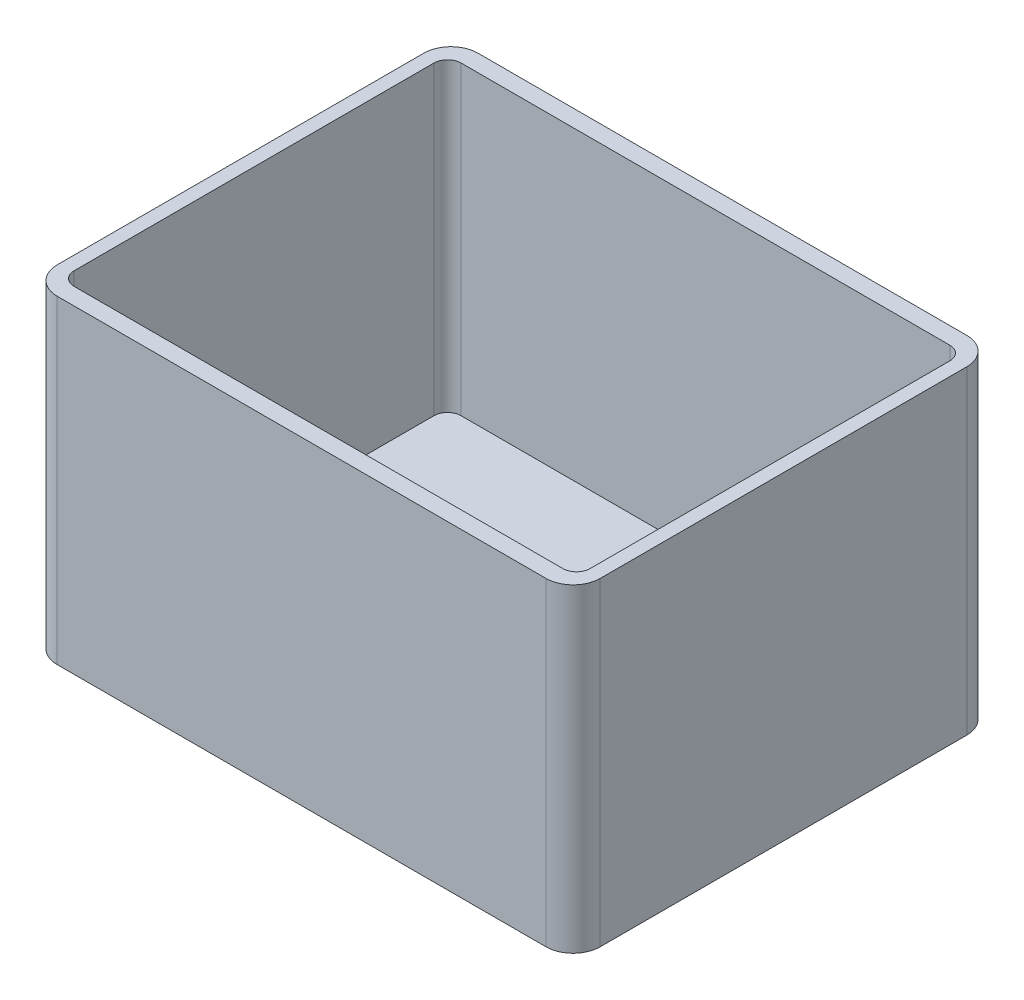
ISO-10303-21;
HEADER;
FILE_DESCRIPTION(('STEP AP214'),'2;1');
FILE_NAME('part.step','',(''),(''),'','','');
FILE_SCHEMA(('AUTOMOTIVE_DESIGN { 1 0 10303 214 1 1 1 1 }'));
ENDSEC;
DATA;
#1=APPLICATION_CONTEXT('core data for automotive mechanical design processes');
#2=APPLICATION_PROTOCOL_DEFINITION('international standard','automotive_design',2000,#1);
#3=PRODUCT_CONTEXT('',#1,'mechanical');
#4=PRODUCT('Part','Part','',(#3));
#5=PRODUCT_RELATED_PRODUCT_CATEGORY('part','',(#4));
#6=PRODUCT_DEFINITION_FORMATION('','',#4);
#7=PRODUCT_DEFINITION_CONTEXT('part definition',#1,'design');
#8=PRODUCT_DEFINITION('design','',#6,#7);
#9=PRODUCT_DEFINITION_SHAPE('','',#8);
#10=(LENGTH_UNIT() NAMED_UNIT(*) SI_UNIT(.MILLI.,.METRE.));
#11=(NAMED_UNIT(*) PLANE_ANGLE_UNIT() SI_UNIT($,.RADIAN.));
#12=(NAMED_UNIT(*) SI_UNIT($,.STERADIAN.) SOLID_ANGLE_UNIT());
#13=UNCERTAINTY_MEASURE_WITH_UNIT(LENGTH_MEASURE(1.E-05),#10,'distance_accuracy_value','');
#14=(GEOMETRIC_REPRESENTATION_CONTEXT(3) GLOBAL_UNCERTAINTY_ASSIGNED_CONTEXT((#13)) GLOBAL_UNIT_ASSIGNED_CONTEXT((#10,
#11,#12)) REPRESENTATION_CONTEXT('',''));
#15=CARTESIAN_POINT('',(0.,0.,0.));
#16=DIRECTION('',(0.,0.,1.));
#17=DIRECTION('',(1.,0.,0.));
#18=AXIS2_PLACEMENT_3D('',#15,#16,#17);
#19=CARTESIAN_POINT('',(-180.,235.,135.));
#20=DIRECTION('',(0.,-1.,0.));
#21=DIRECTION('',(0.,0.,-1.));
#22=AXIS2_PLACEMENT_3D('',#19,#20,#21);
#23=CYLINDRICAL_SURFACE('',#22,20.);
#24=CARTESIAN_POINT('',(-180.,0.,135.));
#25=DIRECTION('',(0.,1.,0.));
#26=DIRECTION('',(0.,0.,-1.));
#27=AXIS2_PLACEMENT_3D('',#24,#25,#26);
#28=CIRCLE('',#27,20.);
#29=CARTESIAN_POINT('',(-200.,0.,135.));
#30=VERTEX_POINT('',#29);
#31=CARTESIAN_POINT('',(-180.,0.,155.));
#32=VERTEX_POINT('',#31);
#33=EDGE_CURVE('E149',#30,#32,#28,.T.);
#34=ORIENTED_EDGE('',*,*,#33,.T.);
#35=DIRECTION('',(0.,-1.,0.));
#36=VECTOR('',#35,1.);
#37=CARTESIAN_POINT('',(-180.,235.,155.));
#38=LINE('',#37,#36);
#39=CARTESIAN_POINT('',(-180.,235.,155.));
#40=VERTEX_POINT('',#39);
#41=EDGE_CURVE('E11',#40,#32,#38,.T.);
#42=ORIENTED_EDGE('',*,*,#41,.F.);
#43=CARTESIAN_POINT('',(-180.,235.,135.));
#44=DIRECTION('',(0.,1.,0.));
#45=DIRECTION('',(0.,0.,-1.));
#46=AXIS2_PLACEMENT_3D('',#43,#44,#45);
#47=CIRCLE('',#46,20.);
#48=CARTESIAN_POINT('',(-200.,235.,135.));
#49=VERTEX_POINT('',#48);
#50=EDGE_CURVE('E165',#49,#40,#47,.T.);
#51=ORIENTED_EDGE('',*,*,#50,.F.);
#52=DIRECTION('',(0.,-1.,0.));
#53=VECTOR('',#52,1.);
#54=CARTESIAN_POINT('',(-200.,235.,135.));
#55=LINE('',#54,#53);
#56=EDGE_CURVE('E145',#49,#30,#55,.T.);
#57=ORIENTED_EDGE('',*,*,#56,.T.);
#58=EDGE_LOOP('',(#34,#42,#51,#57));
#59=FACE_BOUND('',#58,.T.);
#60=ADVANCED_FACE('F41',(#59),#23,.T.);
#61=CARTESIAN_POINT('',(-180.,235.,155.));
#62=DIRECTION('',(0.,0.,-1.));
#63=DIRECTION('',(-1.,0.,0.));
#64=AXIS2_PLACEMENT_3D('',#61,#62,#63);
#65=PLANE('',#64);
#66=DIRECTION('',(1.,0.,0.));
#67=VECTOR('',#66,1.);
#68=CARTESIAN_POINT('',(-180.,0.,155.));
#69=LINE('',#68,#67);
#70=CARTESIAN_POINT('',(180.,0.,155.));
#71=VERTEX_POINT('',#70);
#72=EDGE_CURVE('E152',#32,#71,#69,.T.);
#73=ORIENTED_EDGE('',*,*,#72,.T.);
#74=DIRECTION('',(0.,-1.,0.));
#75=VECTOR('',#74,1.);
#76=CARTESIAN_POINT('',(180.,235.,155.));
#77=LINE('',#76,#75);
#78=CARTESIAN_POINT('',(180.,235.,155.));
#79=VERTEX_POINT('',#78);
#80=EDGE_CURVE('E48',#79,#71,#77,.T.);
#81=ORIENTED_EDGE('',*,*,#80,.F.);
#82=DIRECTION('',(1.,0.,0.));
#83=VECTOR('',#82,1.);
#84=CARTESIAN_POINT('',(-180.,235.,155.));
#85=LINE('',#84,#83);
#86=EDGE_CURVE('E105',#40,#79,#85,.T.);
#87=ORIENTED_EDGE('',*,*,#86,.F.);
#88=ORIENTED_EDGE('',*,*,#41,.T.);
#89=EDGE_LOOP('',(#73,#81,#87,#88));
#90=FACE_BOUND('',#89,.T.);
#91=ADVANCED_FACE('F339',(#90),#65,.F.);
#92=CARTESIAN_POINT('',(180.,235.,135.));
#93=DIRECTION('',(0.,-1.,0.));
#94=DIRECTION('',(0.,0.,-1.));
#95=AXIS2_PLACEMENT_3D('',#92,#93,#94);
#96=CYLINDRICAL_SURFACE('',#95,20.);
#97=CARTESIAN_POINT('',(180.,0.,135.));
#98=DIRECTION('',(0.,1.,0.));
#99=DIRECTION('',(0.,0.,1.));
#100=AXIS2_PLACEMENT_3D('',#97,#98,#99);
#101=CIRCLE('',#100,20.);
#102=CARTESIAN_POINT('',(200.,0.,135.));
#103=VERTEX_POINT('',#102);
#104=EDGE_CURVE('E155',#71,#103,#101,.T.);
#105=ORIENTED_EDGE('',*,*,#104,.T.);
#106=DIRECTION('',(0.,-1.,0.));
#107=VECTOR('',#106,1.);
#108=CARTESIAN_POINT('',(200.,235.,135.));
#109=LINE('',#108,#107);
#110=CARTESIAN_POINT('',(200.,235.,135.));
#111=VERTEX_POINT('',#110);
#112=EDGE_CURVE('E172',#111,#103,#109,.T.);
#113=ORIENTED_EDGE('',*,*,#112,.F.);
#114=CARTESIAN_POINT('',(180.,235.,135.));
#115=DIRECTION('',(0.,1.,0.));
#116=DIRECTION('',(0.,0.,1.));
#117=AXIS2_PLACEMENT_3D('',#114,#115,#116);
#118=CIRCLE('',#117,20.);
#119=EDGE_CURVE('E180',#79,#111,#118,.T.);
#120=ORIENTED_EDGE('',*,*,#119,.F.);
#121=ORIENTED_EDGE('',*,*,#80,.T.);
#122=EDGE_LOOP('',(#105,#113,#120,#121));
#123=FACE_BOUND('',#122,.T.);
#124=ADVANCED_FACE('F178',(#123),#96,.T.);
#125=CARTESIAN_POINT('',(200.,235.,135.));
#126=DIRECTION('',(-1.,0.,0.));
#127=DIRECTION('',(0.,0.,1.));
#128=AXIS2_PLACEMENT_3D('',#125,#126,#127);
#129=PLANE('',#128);
#130=DIRECTION('',(0.,0.,-1.));
#131=VECTOR('',#130,1.);
#132=CARTESIAN_POINT('',(200.,0.,135.));
#133=LINE('',#132,#131);
#134=CARTESIAN_POINT('',(200.,0.,-135.));
#135=VERTEX_POINT('',#134);
#136=EDGE_CURVE('E157',#103,#135,#133,.T.);
#137=ORIENTED_EDGE('',*,*,#136,.T.);
#138=DIRECTION('',(0.,-1.,0.));
#139=VECTOR('',#138,1.);
#140=CARTESIAN_POINT('',(200.,235.,-135.));
#141=LINE('',#140,#139);
#142=CARTESIAN_POINT('',(200.,235.,-135.));
#143=VERTEX_POINT('',#142);
#144=EDGE_CURVE('E169',#143,#135,#141,.T.);
#145=ORIENTED_EDGE('',*,*,#144,.F.);
#146=DIRECTION('',(0.,0.,-1.));
#147=VECTOR('',#146,1.);
#148=CARTESIAN_POINT('',(200.,235.,135.));
#149=LINE('',#148,#147);
#150=EDGE_CURVE('E192',#111,#143,#149,.T.);
#151=ORIENTED_EDGE('',*,*,#150,.F.);
#152=ORIENTED_EDGE('',*,*,#112,.T.);
#153=EDGE_LOOP('',(#137,#145,#151,#152));
#154=FACE_BOUND('',#153,.T.);
#155=ADVANCED_FACE('F188',(#154),#129,.F.);
#156=CARTESIAN_POINT('',(180.,235.,-135.));
#157=DIRECTION('',(0.,-1.,0.));
#158=DIRECTION('',(0.,0.,-1.));
#159=AXIS2_PLACEMENT_3D('',#156,#157,#158);
#160=CYLINDRICAL_SURFACE('',#159,20.);
#161=CARTESIAN_POINT('',(180.,0.,-135.));
#162=DIRECTION('',(0.,1.,0.));
#163=DIRECTION('',(0.,0.,-1.));
#164=AXIS2_PLACEMENT_3D('',#161,#162,#163);
#165=CIRCLE('',#164,20.);
#166=CARTESIAN_POINT('',(180.,0.,-155.));
#167=VERTEX_POINT('',#166);
#168=EDGE_CURVE('E159',#135,#167,#165,.T.);
#169=ORIENTED_EDGE('',*,*,#168,.T.);
#170=DIRECTION('',(0.,-1.,0.));
#171=VECTOR('',#170,1.);
#172=CARTESIAN_POINT('',(180.,235.,-155.));
#173=LINE('',#172,#171);
#174=CARTESIAN_POINT('',(180.,235.,-155.));
#175=VERTEX_POINT('',#174);
#176=EDGE_CURVE('E140',#175,#167,#173,.T.);
#177=ORIENTED_EDGE('',*,*,#176,.F.);
#178=CARTESIAN_POINT('',(180.,235.,-135.));
#179=DIRECTION('',(0.,1.,0.));
#180=DIRECTION('',(0.,0.,-1.));
#181=AXIS2_PLACEMENT_3D('',#178,#179,#180);
#182=CIRCLE('',#181,20.);
#183=EDGE_CURVE('E128',#143,#175,#182,.T.);
#184=ORIENTED_EDGE('',*,*,#183,.F.);
#185=ORIENTED_EDGE('',*,*,#144,.T.);
#186=EDGE_LOOP('',(#169,#177,#184,#185));
#187=FACE_BOUND('',#186,.T.);
#188=ADVANCED_FACE('F191',(#187),#160,.T.);
#189=CARTESIAN_POINT('',(-180.,235.,-155.));
#190=DIRECTION('',(0.,0.,1.));
#191=DIRECTION('',(1.,0.,0.));
#192=AXIS2_PLACEMENT_3D('',#189,#190,#191);
#193=PLANE('',#192);
#194=DIRECTION('',(-1.,0.,0.));
#195=VECTOR('',#194,1.);
#196=CARTESIAN_POINT('',(-180.,0.,-155.));
#197=LINE('',#196,#195);
#198=CARTESIAN_POINT('',(-180.,0.,-155.));
#199=VERTEX_POINT('',#198);
#200=EDGE_CURVE('E137',#167,#199,#197,.T.);
#201=ORIENTED_EDGE('',*,*,#200,.T.);
#202=DIRECTION('',(0.,-1.,0.));
#203=VECTOR('',#202,1.);
#204=CARTESIAN_POINT('',(-180.,235.,-155.));
#205=LINE('',#204,#203);
#206=CARTESIAN_POINT('',(-180.,235.,-155.));
#207=VERTEX_POINT('',#206);
#208=EDGE_CURVE('E134',#207,#199,#205,.T.);
#209=ORIENTED_EDGE('',*,*,#208,.F.);
#210=DIRECTION('',(-1.,0.,0.));
#211=VECTOR('',#210,1.);
#212=CARTESIAN_POINT('',(-180.,235.,-155.));
#213=LINE('',#212,#211);
#214=EDGE_CURVE('E121',#175,#207,#213,.T.);
#215=ORIENTED_EDGE('',*,*,#214,.F.);
#216=ORIENTED_EDGE('',*,*,#176,.T.);
#217=EDGE_LOOP('',(#201,#209,#215,#216));
#218=FACE_BOUND('',#217,.T.);
#219=ADVANCED_FACE('F135',(#218),#193,.F.);
#220=CARTESIAN_POINT('',(-180.,235.,-135.));
#221=DIRECTION('',(0.,-1.,0.));
#222=DIRECTION('',(0.,0.,-1.));
#223=AXIS2_PLACEMENT_3D('',#220,#221,#222);
#224=CYLINDRICAL_SURFACE('',#223,20.);
#225=CARTESIAN_POINT('',(-180.,0.,-135.));
#226=DIRECTION('',(0.,1.,0.));
#227=DIRECTION('',(0.,0.,-1.));
#228=AXIS2_PLACEMENT_3D('',#225,#226,#227);
#229=CIRCLE('',#228,20.);
#230=CARTESIAN_POINT('',(-200.,0.,-135.));
#231=VERTEX_POINT('',#230);
#232=EDGE_CURVE('E162',#199,#231,#229,.T.);
#233=ORIENTED_EDGE('',*,*,#232,.T.);
#234=DIRECTION('',(0.,-1.,0.));
#235=VECTOR('',#234,1.);
#236=CARTESIAN_POINT('',(-200.,235.,-135.));
#237=LINE('',#236,#235);
#238=CARTESIAN_POINT('',(-200.,235.,-135.));
#239=VERTEX_POINT('',#238);
#240=EDGE_CURVE('E141',#239,#231,#237,.T.);
#241=ORIENTED_EDGE('',*,*,#240,.F.);
#242=CARTESIAN_POINT('',(-180.,235.,-135.));
#243=DIRECTION('',(0.,1.,0.));
#244=DIRECTION('',(0.,0.,-1.));
#245=AXIS2_PLACEMENT_3D('',#242,#243,#244);
#246=CIRCLE('',#245,20.);
#247=EDGE_CURVE('E125',#207,#239,#246,.T.);
#248=ORIENTED_EDGE('',*,*,#247,.F.);
#249=ORIENTED_EDGE('',*,*,#208,.T.);
#250=EDGE_LOOP('',(#233,#241,#248,#249));
#251=FACE_BOUND('',#250,.T.);
#252=ADVANCED_FACE('F143',(#251),#224,.T.);
#253=CARTESIAN_POINT('',(-200.,235.,135.));
#254=DIRECTION('',(1.,0.,0.));
#255=DIRECTION('',(0.,0.,-1.));
#256=AXIS2_PLACEMENT_3D('',#253,#254,#255);
#257=PLANE('',#256);
#258=DIRECTION('',(0.,0.,1.));
#259=VECTOR('',#258,1.);
#260=CARTESIAN_POINT('',(-200.,0.,135.));
#261=LINE('',#260,#259);
#262=EDGE_CURVE('E97',#231,#30,#261,.T.);
#263=ORIENTED_EDGE('',*,*,#262,.T.);
#264=ORIENTED_EDGE('',*,*,#56,.F.);
#265=DIRECTION('',(0.,0.,1.));
#266=VECTOR('',#265,1.);
#267=CARTESIAN_POINT('',(-200.,235.,135.));
#268=LINE('',#267,#266);
#269=EDGE_CURVE('E64',#239,#49,#268,.T.);
#270=ORIENTED_EDGE('',*,*,#269,.F.);
#271=ORIENTED_EDGE('',*,*,#240,.T.);
#272=EDGE_LOOP('',(#263,#264,#270,#271));
#273=FACE_BOUND('',#272,.T.);
#274=ADVANCED_FACE('F346',(#273),#257,.F.);
#275=CARTESIAN_POINT('',(-180.,235.,135.));
#276=DIRECTION('',(0.,-1.,0.));
#277=DIRECTION('',(0.,0.,-1.));
#278=AXIS2_PLACEMENT_3D('',#275,#276,#277);
#279=PLANE('',#278);
#280=DIRECTION('',(1.,0.,0.));
#281=VECTOR('',#280,1.);
#282=CARTESIAN_POINT('',(-180.,235.,142.5));
#283=LINE('',#282,#281);
#284=CARTESIAN_POINT('',(-180.,235.,142.5));
#285=VERTEX_POINT('',#284);
#286=CARTESIAN_POINT('',(180.,235.,142.5));
#287=VERTEX_POINT('',#286);
#288=EDGE_CURVE('E239',#285,#287,#283,.T.);
#289=ORIENTED_EDGE('',*,*,#288,.F.);
#290=CARTESIAN_POINT('',(-180.,235.,132.5));
#291=DIRECTION('',(0.,1.,0.));
#292=DIRECTION('',(0.,0.,-1.));
#293=AXIS2_PLACEMENT_3D('',#290,#291,#292);
#294=CIRCLE('',#293,10.);
#295=CARTESIAN_POINT('',(-190.,235.,132.5));
#296=VERTEX_POINT('',#295);
#297=EDGE_CURVE('E55',#296,#285,#294,.T.);
#298=ORIENTED_EDGE('',*,*,#297,.F.);
#299=DIRECTION('',(0.,0.,1.));
#300=VECTOR('',#299,1.);
#301=CARTESIAN_POINT('',(-190.,235.,132.5));
#302=LINE('',#301,#300);
#303=CARTESIAN_POINT('',(-190.,235.,-132.5));
#304=VERTEX_POINT('',#303);
#305=EDGE_CURVE('E220',#304,#296,#302,.T.);
#306=ORIENTED_EDGE('',*,*,#305,.F.);
#307=CARTESIAN_POINT('',(-180.,235.,-132.5));
#308=DIRECTION('',(0.,1.,0.));
#309=DIRECTION('',(0.,0.,-1.));
#310=AXIS2_PLACEMENT_3D('',#307,#308,#309);
#311=CIRCLE('',#310,10.);
#312=CARTESIAN_POINT('',(-180.,235.,-142.5));
#313=VERTEX_POINT('',#312);
#314=EDGE_CURVE('E224',#313,#304,#311,.T.);
#315=ORIENTED_EDGE('',*,*,#314,.F.);
#316=DIRECTION('',(-1.,0.,0.));
#317=VECTOR('',#316,1.);
#318=CARTESIAN_POINT('',(-180.,235.,-142.5));
#319=LINE('',#318,#317);
#320=CARTESIAN_POINT('',(180.,235.,-142.5));
#321=VERTEX_POINT('',#320);
#322=EDGE_CURVE('E227',#321,#313,#319,.T.);
#323=ORIENTED_EDGE('',*,*,#322,.F.);
#324=CARTESIAN_POINT('',(180.,235.,-132.5));
#325=DIRECTION('',(0.,1.,0.));
#326=DIRECTION('',(0.,0.,-1.));
#327=AXIS2_PLACEMENT_3D('',#324,#325,#326);
#328=CIRCLE('',#327,10.);
#329=CARTESIAN_POINT('',(190.,235.,-132.5));
#330=VERTEX_POINT('',#329);
#331=EDGE_CURVE('E230',#330,#321,#328,.T.);
#332=ORIENTED_EDGE('',*,*,#331,.F.);
#333=DIRECTION('',(0.,0.,-1.));
#334=VECTOR('',#333,1.);
#335=CARTESIAN_POINT('',(190.,235.,132.5));
#336=LINE('',#335,#334);
#337=CARTESIAN_POINT('',(190.,235.,132.5));
#338=VERTEX_POINT('',#337);
#339=EDGE_CURVE('E233',#338,#330,#336,.T.);
#340=ORIENTED_EDGE('',*,*,#339,.F.);
#341=CARTESIAN_POINT('',(180.,235.,132.5));
#342=DIRECTION('',(0.,1.,0.));
#343=DIRECTION('',(0.,0.,1.));
#344=AXIS2_PLACEMENT_3D('',#341,#342,#343);
#345=CIRCLE('',#344,10.);
#346=EDGE_CURVE('E236',#287,#338,#345,.T.);
#347=ORIENTED_EDGE('',*,*,#346,.F.);
#348=EDGE_LOOP('',(#289,#298,#306,#315,#323,#332,#340,#347));
#349=FACE_BOUND('',#348,.T.);
#350=ORIENTED_EDGE('',*,*,#50,.T.);
#351=ORIENTED_EDGE('',*,*,#86,.T.);
#352=ORIENTED_EDGE('',*,*,#119,.T.);
#353=ORIENTED_EDGE('',*,*,#150,.T.);
#354=ORIENTED_EDGE('',*,*,#183,.T.);
#355=ORIENTED_EDGE('',*,*,#214,.T.);
#356=ORIENTED_EDGE('',*,*,#247,.T.);
#357=ORIENTED_EDGE('',*,*,#269,.T.);
#358=EDGE_LOOP('',(#350,#351,#352,#353,#354,#355,#356,#357));
#359=FACE_BOUND('',#358,.T.);
#360=ADVANCED_FACE('F123',(#349,#359),#279,.F.);
#361=CARTESIAN_POINT('',(-180.,0.,135.));
#362=DIRECTION('',(0.,-1.,0.));
#363=DIRECTION('',(0.,0.,-1.));
#364=AXIS2_PLACEMENT_3D('',#361,#362,#363);
#365=PLANE('',#364);
#366=ORIENTED_EDGE('',*,*,#33,.F.);
#367=ORIENTED_EDGE('',*,*,#262,.F.);
#368=ORIENTED_EDGE('',*,*,#232,.F.);
#369=ORIENTED_EDGE('',*,*,#200,.F.);
#370=ORIENTED_EDGE('',*,*,#168,.F.);
#371=ORIENTED_EDGE('',*,*,#136,.F.);
#372=ORIENTED_EDGE('',*,*,#104,.F.);
#373=ORIENTED_EDGE('',*,*,#72,.F.);
#374=EDGE_LOOP('',(#366,#367,#368,#369,#370,#371,#372,#373));
#375=FACE_BOUND('',#374,.T.);
#376=ADVANCED_FACE('F184',(#375),#365,.T.);
#377=CARTESIAN_POINT('',(-180.,9.99999999999998,132.5));
#378=DIRECTION('',(0.,1.,0.));
#379=DIRECTION('',(0.,0.,1.));
#380=AXIS2_PLACEMENT_3D('',#377,#378,#379);
#381=CYLINDRICAL_SURFACE('',#380,10.);
#382=ORIENTED_EDGE('',*,*,#297,.T.);
#383=DIRECTION('',(0.,1.,0.));
#384=VECTOR('',#383,1.);
#385=CARTESIAN_POINT('',(-180.,9.99999999999998,142.5));
#386=LINE('',#385,#384);
#387=CARTESIAN_POINT('',(-180.,9.99999999999998,142.5));
#388=VERTEX_POINT('',#387);
#389=EDGE_CURVE('E198',#388,#285,#386,.T.);
#390=ORIENTED_EDGE('',*,*,#389,.F.);
#391=CARTESIAN_POINT('',(-180.,9.99999999999998,132.5));
#392=DIRECTION('',(0.,1.,0.));
#393=DIRECTION('',(0.,0.,-1.));
#394=AXIS2_PLACEMENT_3D('',#391,#392,#393);
#395=CIRCLE('',#394,10.);
#396=CARTESIAN_POINT('',(-190.,9.99999999999998,132.5));
#397=VERTEX_POINT('',#396);
#398=EDGE_CURVE('E223',#397,#388,#395,.T.);
#399=ORIENTED_EDGE('',*,*,#398,.F.);
#400=DIRECTION('',(0.,1.,0.));
#401=VECTOR('',#400,1.);
#402=CARTESIAN_POINT('',(-190.,9.99999999999998,132.5));
#403=LINE('',#402,#401);
#404=EDGE_CURVE('E153',#397,#296,#403,.T.);
#405=ORIENTED_EDGE('',*,*,#404,.T.);
#406=EDGE_LOOP('',(#382,#390,#399,#405));
#407=FACE_BOUND('',#406,.T.);
#408=ADVANCED_FACE('F272',(#407),#381,.F.);
#409=CARTESIAN_POINT('',(-190.,9.99999999999998,132.5));
#410=DIRECTION('',(-1.,0.,0.));
#411=DIRECTION('',(0.,0.,1.));
#412=AXIS2_PLACEMENT_3D('',#409,#410,#411);
#413=PLANE('',#412);
#414=ORIENTED_EDGE('',*,*,#305,.T.);
#415=ORIENTED_EDGE('',*,*,#404,.F.);
#416=DIRECTION('',(0.,0.,1.));
#417=VECTOR('',#416,1.);
#418=CARTESIAN_POINT('',(-190.,9.99999999999998,132.5));
#419=LINE('',#418,#417);
#420=CARTESIAN_POINT('',(-190.,9.99999999999998,-132.5));
#421=VERTEX_POINT('',#420);
#422=EDGE_CURVE('E201',#421,#397,#419,.T.);
#423=ORIENTED_EDGE('',*,*,#422,.F.);
#424=DIRECTION('',(0.,1.,0.));
#425=VECTOR('',#424,1.);
#426=CARTESIAN_POINT('',(-190.,9.99999999999998,-132.5));
#427=LINE('',#426,#425);
#428=EDGE_CURVE('E216',#421,#304,#427,.T.);
#429=ORIENTED_EDGE('',*,*,#428,.T.);
#430=EDGE_LOOP('',(#414,#415,#423,#429));
#431=FACE_BOUND('',#430,.T.);
#432=ADVANCED_FACE('F292',(#431),#413,.F.);
#433=CARTESIAN_POINT('',(-180.,9.99999999999998,-132.5));
#434=DIRECTION('',(0.,1.,0.));
#435=DIRECTION('',(0.,0.,1.));
#436=AXIS2_PLACEMENT_3D('',#433,#434,#435);
#437=CYLINDRICAL_SURFACE('',#436,10.);
#438=ORIENTED_EDGE('',*,*,#314,.T.);
#439=ORIENTED_EDGE('',*,*,#428,.F.);
#440=CARTESIAN_POINT('',(-180.,9.99999999999998,-132.5));
#441=DIRECTION('',(0.,1.,0.));
#442=DIRECTION('',(0.,0.,-1.));
#443=AXIS2_PLACEMENT_3D('',#440,#441,#442);
#444=CIRCLE('',#443,10.);
#445=CARTESIAN_POINT('',(-180.,9.99999999999998,-142.5));
#446=VERTEX_POINT('',#445);
#447=EDGE_CURVE('E245',#446,#421,#444,.T.);
#448=ORIENTED_EDGE('',*,*,#447,.F.);
#449=DIRECTION('',(0.,1.,0.));
#450=VECTOR('',#449,1.);
#451=CARTESIAN_POINT('',(-180.,9.99999999999998,-142.5));
#452=LINE('',#451,#450);
#453=EDGE_CURVE('E213',#446,#313,#452,.T.);
#454=ORIENTED_EDGE('',*,*,#453,.T.);
#455=EDGE_LOOP('',(#438,#439,#448,#454));
#456=FACE_BOUND('',#455,.T.);
#457=ADVANCED_FACE('F297',(#456),#437,.F.);
#458=CARTESIAN_POINT('',(-180.,9.99999999999998,-142.5));
#459=DIRECTION('',(0.,0.,-1.));
#460=DIRECTION('',(-1.,0.,0.));
#461=AXIS2_PLACEMENT_3D('',#458,#459,#460);
#462=PLANE('',#461);
#463=ORIENTED_EDGE('',*,*,#322,.T.);
#464=ORIENTED_EDGE('',*,*,#453,.F.);
#465=DIRECTION('',(-1.,0.,0.));
#466=VECTOR('',#465,1.);
#467=CARTESIAN_POINT('',(-180.,9.99999999999998,-142.5));
#468=LINE('',#467,#466);
#469=CARTESIAN_POINT('',(180.,9.99999999999998,-142.5));
#470=VERTEX_POINT('',#469);
#471=EDGE_CURVE('E248',#470,#446,#468,.T.);
#472=ORIENTED_EDGE('',*,*,#471,.F.);
#473=DIRECTION('',(0.,1.,0.));
#474=VECTOR('',#473,1.);
#475=CARTESIAN_POINT('',(180.,9.99999999999998,-142.5));
#476=LINE('',#475,#474);
#477=EDGE_CURVE('E210',#470,#321,#476,.T.);
#478=ORIENTED_EDGE('',*,*,#477,.T.);
#479=EDGE_LOOP('',(#463,#464,#472,#478));
#480=FACE_BOUND('',#479,.T.);
#481=ADVANCED_FACE('F323',(#480),#462,.F.);
#482=CARTESIAN_POINT('',(180.,9.99999999999998,-132.5));
#483=DIRECTION('',(0.,1.,0.));
#484=DIRECTION('',(0.,0.,1.));
#485=AXIS2_PLACEMENT_3D('',#482,#483,#484);
#486=CYLINDRICAL_SURFACE('',#485,10.);
#487=ORIENTED_EDGE('',*,*,#331,.T.);
#488=ORIENTED_EDGE('',*,*,#477,.F.);
#489=CARTESIAN_POINT('',(180.,9.99999999999998,-132.5));
#490=DIRECTION('',(0.,1.,0.));
#491=DIRECTION('',(0.,0.,-1.));
#492=AXIS2_PLACEMENT_3D('',#489,#490,#491);
#493=CIRCLE('',#492,10.);
#494=CARTESIAN_POINT('',(190.,9.99999999999998,-132.5));
#495=VERTEX_POINT('',#494);
#496=EDGE_CURVE('E251',#495,#470,#493,.T.);
#497=ORIENTED_EDGE('',*,*,#496,.F.);
#498=DIRECTION('',(0.,1.,0.));
#499=VECTOR('',#498,1.);
#500=CARTESIAN_POINT('',(190.,9.99999999999998,-132.5));
#501=LINE('',#500,#499);
#502=EDGE_CURVE('E207',#495,#330,#501,.T.);
#503=ORIENTED_EDGE('',*,*,#502,.T.);
#504=EDGE_LOOP('',(#487,#488,#497,#503));
#505=FACE_BOUND('',#504,.T.);
#506=ADVANCED_FACE('F326',(#505),#486,.F.);
#507=CARTESIAN_POINT('',(190.,9.99999999999998,132.5));
#508=DIRECTION('',(1.,0.,0.));
#509=DIRECTION('',(0.,0.,-1.));
#510=AXIS2_PLACEMENT_3D('',#507,#508,#509);
#511=PLANE('',#510);
#512=ORIENTED_EDGE('',*,*,#339,.T.);
#513=ORIENTED_EDGE('',*,*,#502,.F.);
#514=DIRECTION('',(0.,0.,-1.));
#515=VECTOR('',#514,1.);
#516=CARTESIAN_POINT('',(190.,9.99999999999998,132.5));
#517=LINE('',#516,#515);
#518=CARTESIAN_POINT('',(190.,9.99999999999998,132.5));
#519=VERTEX_POINT('',#518);
#520=EDGE_CURVE('E254',#519,#495,#517,.T.);
#521=ORIENTED_EDGE('',*,*,#520,.F.);
#522=DIRECTION('',(0.,1.,0.));
#523=VECTOR('',#522,1.);
#524=CARTESIAN_POINT('',(190.,9.99999999999998,132.5));
#525=LINE('',#524,#523);
#526=EDGE_CURVE('E204',#519,#338,#525,.T.);
#527=ORIENTED_EDGE('',*,*,#526,.T.);
#528=EDGE_LOOP('',(#512,#513,#521,#527));
#529=FACE_BOUND('',#528,.T.);
#530=ADVANCED_FACE('F329',(#529),#511,.F.);
#531=CARTESIAN_POINT('',(180.,9.99999999999998,132.5));
#532=DIRECTION('',(0.,1.,0.));
#533=DIRECTION('',(0.,0.,1.));
#534=AXIS2_PLACEMENT_3D('',#531,#532,#533);
#535=CYLINDRICAL_SURFACE('',#534,10.);
#536=ORIENTED_EDGE('',*,*,#346,.T.);
#537=ORIENTED_EDGE('',*,*,#526,.F.);
#538=CARTESIAN_POINT('',(180.,9.99999999999998,132.5));
#539=DIRECTION('',(0.,1.,0.));
#540=DIRECTION('',(0.,0.,1.));
#541=AXIS2_PLACEMENT_3D('',#538,#539,#540);
#542=CIRCLE('',#541,10.);
#543=CARTESIAN_POINT('',(180.,9.99999999999998,142.5));
#544=VERTEX_POINT('',#543);
#545=EDGE_CURVE('E257',#544,#519,#542,.T.);
#546=ORIENTED_EDGE('',*,*,#545,.F.);
#547=DIRECTION('',(0.,1.,0.));
#548=VECTOR('',#547,1.);
#549=CARTESIAN_POINT('',(180.,9.99999999999998,142.5));
#550=LINE('',#549,#548);
#551=EDGE_CURVE('E200',#544,#287,#550,.T.);
#552=ORIENTED_EDGE('',*,*,#551,.T.);
#553=EDGE_LOOP('',(#536,#537,#546,#552));
#554=FACE_BOUND('',#553,.T.);
#555=ADVANCED_FACE('F312',(#554),#535,.F.);
#556=CARTESIAN_POINT('',(-180.,9.99999999999998,142.5));
#557=DIRECTION('',(0.,0.,1.));
#558=DIRECTION('',(1.,0.,0.));
#559=AXIS2_PLACEMENT_3D('',#556,#557,#558);
#560=PLANE('',#559);
#561=ORIENTED_EDGE('',*,*,#288,.T.);
#562=ORIENTED_EDGE('',*,*,#551,.F.);
#563=DIRECTION('',(1.,0.,0.));
#564=VECTOR('',#563,1.);
#565=CARTESIAN_POINT('',(-180.,9.99999999999998,142.5));
#566=LINE('',#565,#564);
#567=EDGE_CURVE('E260',#388,#544,#566,.T.);
#568=ORIENTED_EDGE('',*,*,#567,.F.);
#569=ORIENTED_EDGE('',*,*,#389,.T.);
#570=EDGE_LOOP('',(#561,#562,#568,#569));
#571=FACE_BOUND('',#570,.T.);
#572=ADVANCED_FACE('F306',(#571),#560,.F.);
#573=CARTESIAN_POINT('',(-180.,9.99999999999998,132.5));
#574=DIRECTION('',(0.,-1.,0.));
#575=DIRECTION('',(0.,0.,-1.));
#576=AXIS2_PLACEMENT_3D('',#573,#574,#575);
#577=PLANE('',#576);
#578=ORIENTED_EDGE('',*,*,#398,.T.);
#579=ORIENTED_EDGE('',*,*,#567,.T.);
#580=ORIENTED_EDGE('',*,*,#545,.T.);
#581=ORIENTED_EDGE('',*,*,#520,.T.);
#582=ORIENTED_EDGE('',*,*,#496,.T.);
#583=ORIENTED_EDGE('',*,*,#471,.T.);
#584=ORIENTED_EDGE('',*,*,#447,.T.);
#585=ORIENTED_EDGE('',*,*,#422,.T.);
#586=EDGE_LOOP('',(#578,#579,#580,#581,#582,#583,#584,#585));
#587=FACE_BOUND('',#586,.T.);
#588=ADVANCED_FACE('F267',(#587),#577,.F.);
#589=CLOSED_SHELL('',(#60,#91,#124,#155,#188,#219,#252,#274,#360,#376,#408,#432,#457,#481,#506,
#530,#555,#572,#588));
#590=MANIFOLD_SOLID_BREP('B2',#589);
#591=ADVANCED_BREP_SHAPE_REPRESENTATION('',(#18,#590),#14);
#592=SHAPE_DEFINITION_REPRESENTATION(#9,#591);
ENDSEC;
END-ISO-10303-21;
